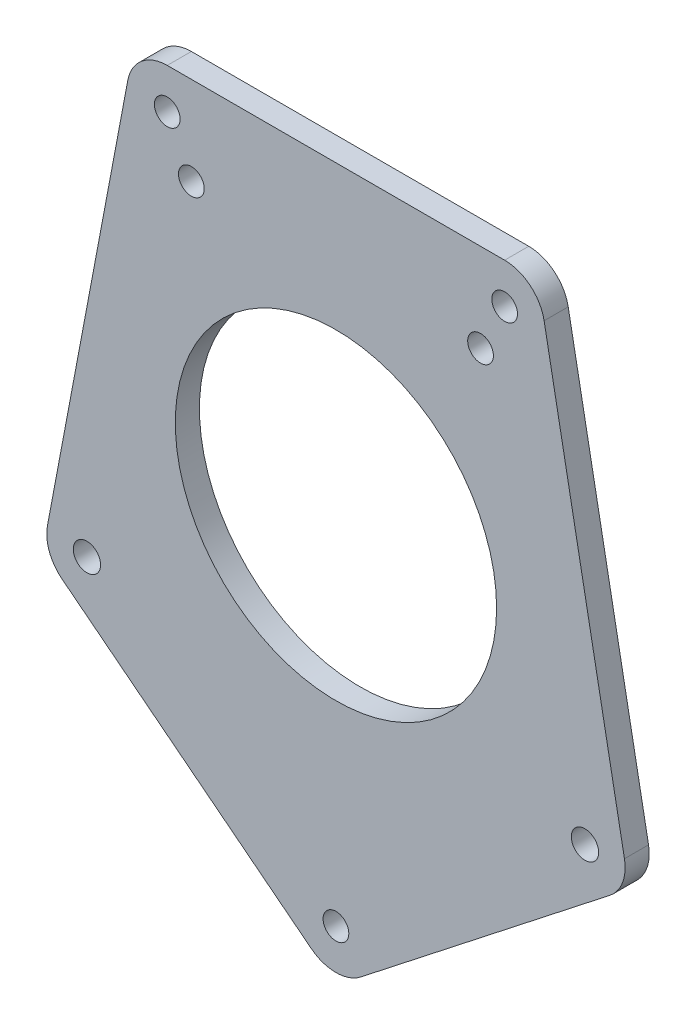
ISO-10303-21;
HEADER;
FILE_DESCRIPTION(('STEP AP214'),'2;1');
FILE_NAME('part.step','',(''),(''),'','','');
FILE_SCHEMA(('AUTOMOTIVE_DESIGN { 1 0 10303 214 1 1 1 1 }'));
ENDSEC;
DATA;
#1=APPLICATION_CONTEXT('core data for automotive mechanical design processes');
#2=APPLICATION_PROTOCOL_DEFINITION('international standard','automotive_design',2000,#1);
#3=PRODUCT_CONTEXT('',#1,'mechanical');
#4=PRODUCT('Part','Part','',(#3));
#5=PRODUCT_RELATED_PRODUCT_CATEGORY('part','',(#4));
#6=PRODUCT_DEFINITION_FORMATION('','',#4);
#7=PRODUCT_DEFINITION_CONTEXT('part definition',#1,'design');
#8=PRODUCT_DEFINITION('design','',#6,#7);
#9=PRODUCT_DEFINITION_SHAPE('','',#8);
#10=(LENGTH_UNIT() NAMED_UNIT(*) SI_UNIT(.MILLI.,.METRE.));
#11=(NAMED_UNIT(*) PLANE_ANGLE_UNIT() SI_UNIT($,.RADIAN.));
#12=(NAMED_UNIT(*) SI_UNIT($,.STERADIAN.) SOLID_ANGLE_UNIT());
#13=UNCERTAINTY_MEASURE_WITH_UNIT(LENGTH_MEASURE(1.E-05),#10,'distance_accuracy_value','');
#14=(GEOMETRIC_REPRESENTATION_CONTEXT(3) GLOBAL_UNCERTAINTY_ASSIGNED_CONTEXT((#13)) GLOBAL_UNIT_ASSIGNED_CONTEXT((#10,
#11,#12)) REPRESENTATION_CONTEXT('',''));
#15=CARTESIAN_POINT('',(0.,0.,0.));
#16=DIRECTION('',(0.,0.,1.));
#17=DIRECTION('',(1.,0.,0.));
#18=AXIS2_PLACEMENT_3D('',#15,#16,#17);
#19=CARTESIAN_POINT('',(-31.,0.,3.));
#20=DIRECTION('',(0.,0.,1.));
#21=DIRECTION('',(1.,0.,0.));
#22=AXIS2_PLACEMENT_3D('',#19,#20,#21);
#23=PLANE('',#22);
#24=CARTESIAN_POINT('',(18.,47.,3.));
#25=DIRECTION('',(0.,0.,1.));
#26=DIRECTION('',(1.,0.,0.));
#27=AXIS2_PLACEMENT_3D('',#24,#25,#26);
#28=CIRCLE('',#27,1.6);
#29=CARTESIAN_POINT('',(19.6,47.,3.));
#30=VERTEX_POINT('',#29);
#31=EDGE_CURVE('E242',#30,#30,#28,.T.);
#32=ORIENTED_EDGE('',*,*,#31,.F.);
#33=EDGE_LOOP('',(#32));
#34=FACE_BOUND('',#33,.T.);
#35=CARTESIAN_POINT('',(-18.,47.,3.));
#36=DIRECTION('',(0.,0.,1.));
#37=DIRECTION('',(1.,0.,0.));
#38=AXIS2_PLACEMENT_3D('',#35,#36,#37);
#39=CIRCLE('',#38,1.6);
#40=CARTESIAN_POINT('',(-16.4,47.,3.));
#41=VERTEX_POINT('',#40);
#42=EDGE_CURVE('E230',#41,#41,#39,.T.);
#43=ORIENTED_EDGE('',*,*,#42,.F.);
#44=EDGE_LOOP('',(#43));
#45=FACE_BOUND('',#44,.T.);
#46=CARTESIAN_POINT('',(31.,0.,3.));
#47=DIRECTION('',(0.,0.,1.));
#48=DIRECTION('',(1.,0.,0.));
#49=AXIS2_PLACEMENT_3D('',#46,#47,#48);
#50=CIRCLE('',#49,1.7);
#51=CARTESIAN_POINT('',(32.7,0.,3.));
#52=VERTEX_POINT('',#51);
#53=EDGE_CURVE('E218',#52,#52,#50,.T.);
#54=ORIENTED_EDGE('',*,*,#53,.F.);
#55=EDGE_LOOP('',(#54));
#56=FACE_BOUND('',#55,.T.);
#57=CARTESIAN_POINT('',(21.,53.,3.));
#58=DIRECTION('',(0.,0.,1.));
#59=DIRECTION('',(1.,0.,0.));
#60=AXIS2_PLACEMENT_3D('',#57,#58,#59);
#61=CIRCLE('',#60,1.6);
#62=CARTESIAN_POINT('',(22.6,53.,3.));
#63=VERTEX_POINT('',#62);
#64=EDGE_CURVE('E146',#63,#63,#61,.T.);
#65=ORIENTED_EDGE('',*,*,#64,.F.);
#66=EDGE_LOOP('',(#65));
#67=FACE_BOUND('',#66,.T.);
#68=CARTESIAN_POINT('',(-31.,0.,3.));
#69=DIRECTION('',(0.,0.,1.));
#70=DIRECTION('',(1.,0.,0.));
#71=AXIS2_PLACEMENT_3D('',#68,#69,#70);
#72=CIRCLE('',#71,5.);
#73=CARTESIAN_POINT('',(-35.9133082687424,0.927039295989146,3.));
#74=VERTEX_POINT('',#73);
#75=CARTESIAN_POINT('',(-34.0846208341593,-3.93511299831026,3.));
#76=VERTEX_POINT('',#75);
#77=EDGE_CURVE('E161',#74,#76,#72,.T.);
#78=ORIENTED_EDGE('',*,*,#77,.T.);
#79=DIRECTION('',(0.787022599662049,-0.616924166831864,0.));
#80=VECTOR('',#79,1.);
#81=CARTESIAN_POINT('',(-34.0846208341593,-3.93511299831026,3.));
#82=LINE('',#81,#80);
#83=CARTESIAN_POINT('',(-3.08462083415934,-28.2351129983102,3.));
#84=VERTEX_POINT('',#83);
#85=EDGE_CURVE('E99',#76,#84,#82,.T.);
#86=ORIENTED_EDGE('',*,*,#85,.T.);
#87=CARTESIAN_POINT('',(0.,-24.3,3.));
#88=DIRECTION('',(0.,0.,1.));
#89=DIRECTION('',(1.,0.,0.));
#90=AXIS2_PLACEMENT_3D('',#87,#88,#89);
#91=CIRCLE('',#90,5.);
#92=CARTESIAN_POINT('',(3.08462083415935,-28.2351129983102,3.));
#93=VERTEX_POINT('',#92);
#94=EDGE_CURVE('E182',#84,#93,#91,.T.);
#95=ORIENTED_EDGE('',*,*,#94,.T.);
#96=DIRECTION('',(0.787022599662049,0.616924166831864,0.));
#97=VECTOR('',#96,1.);
#98=CARTESIAN_POINT('',(3.08462083415935,-28.2351129983102,3.));
#99=LINE('',#98,#97);
#100=CARTESIAN_POINT('',(34.0846208341593,-3.93511299831026,3.));
#101=VERTEX_POINT('',#100);
#102=EDGE_CURVE('E201',#93,#101,#99,.T.);
#103=ORIENTED_EDGE('',*,*,#102,.T.);
#104=CARTESIAN_POINT('',(31.,0.,3.));
#105=DIRECTION('',(0.,0.,1.));
#106=DIRECTION('',(1.,0.,0.));
#107=AXIS2_PLACEMENT_3D('',#104,#105,#106);
#108=CIRCLE('',#107,5.);
#109=CARTESIAN_POINT('',(35.9133082687423,0.927039295989146,3.));
#110=VERTEX_POINT('',#109);
#111=EDGE_CURVE('E198',#101,#110,#108,.T.);
#112=ORIENTED_EDGE('',*,*,#111,.T.);
#113=DIRECTION('',(-0.185407859197825,0.982661653748471,0.));
#114=VECTOR('',#113,1.);
#115=CARTESIAN_POINT('',(35.9133082687423,0.927039295989146,3.));
#116=LINE('',#115,#114);
#117=CARTESIAN_POINT('',(25.9133082687424,53.9270392959891,3.));
#118=VERTEX_POINT('',#117);
#119=EDGE_CURVE('E200',#110,#118,#116,.T.);
#120=ORIENTED_EDGE('',*,*,#119,.T.);
#121=CARTESIAN_POINT('',(21.,53.,3.));
#122=DIRECTION('',(0.,0.,1.));
#123=DIRECTION('',(1.,0.,0.));
#124=AXIS2_PLACEMENT_3D('',#121,#122,#123);
#125=CIRCLE('',#124,5.);
#126=CARTESIAN_POINT('',(21.,58.,3.));
#127=VERTEX_POINT('',#126);
#128=EDGE_CURVE('E124',#118,#127,#125,.T.);
#129=ORIENTED_EDGE('',*,*,#128,.T.);
#130=DIRECTION('',(-1.,0.,0.));
#131=VECTOR('',#130,1.);
#132=CARTESIAN_POINT('',(21.,58.,3.));
#133=LINE('',#132,#131);
#134=CARTESIAN_POINT('',(-21.,58.,3.));
#135=VERTEX_POINT('',#134);
#136=EDGE_CURVE('E118',#127,#135,#133,.T.);
#137=ORIENTED_EDGE('',*,*,#136,.T.);
#138=CARTESIAN_POINT('',(-21.,53.,3.));
#139=DIRECTION('',(0.,0.,1.));
#140=DIRECTION('',(1.,0.,0.));
#141=AXIS2_PLACEMENT_3D('',#138,#139,#140);
#142=CIRCLE('',#141,5.);
#143=CARTESIAN_POINT('',(-25.9133082687424,53.9270392959891,3.));
#144=VERTEX_POINT('',#143);
#145=EDGE_CURVE('E122',#135,#144,#142,.T.);
#146=ORIENTED_EDGE('',*,*,#145,.T.);
#147=DIRECTION('',(-0.185407859197825,-0.982661653748471,0.));
#148=VECTOR('',#147,1.);
#149=CARTESIAN_POINT('',(-25.9133082687424,53.9270392959891,3.));
#150=LINE('',#149,#148);
#151=EDGE_CURVE('E50',#144,#74,#150,.T.);
#152=ORIENTED_EDGE('',*,*,#151,.T.);
#153=EDGE_LOOP('',(#78,#86,#95,#103,#112,#120,#129,#137,#146,#152));
#154=FACE_BOUND('',#153,.T.);
#155=CARTESIAN_POINT('',(-21.,53.,3.));
#156=DIRECTION('',(0.,0.,1.));
#157=DIRECTION('',(1.,0.,0.));
#158=AXIS2_PLACEMENT_3D('',#155,#156,#157);
#159=CIRCLE('',#158,1.6);
#160=CARTESIAN_POINT('',(-19.4,53.,3.));
#161=VERTEX_POINT('',#160);
#162=EDGE_CURVE('E212',#161,#161,#159,.T.);
#163=ORIENTED_EDGE('',*,*,#162,.F.);
#164=EDGE_LOOP('',(#163));
#165=FACE_BOUND('',#164,.T.);
#166=CARTESIAN_POINT('',(-31.,0.,3.));
#167=DIRECTION('',(0.,0.,1.));
#168=DIRECTION('',(1.,0.,0.));
#169=AXIS2_PLACEMENT_3D('',#166,#167,#168);
#170=CIRCLE('',#169,1.7);
#171=CARTESIAN_POINT('',(-29.3,0.,3.));
#172=VERTEX_POINT('',#171);
#173=EDGE_CURVE('E224',#172,#172,#170,.T.);
#174=ORIENTED_EDGE('',*,*,#173,.F.);
#175=EDGE_LOOP('',(#174));
#176=FACE_BOUND('',#175,.T.);
#177=CARTESIAN_POINT('',(0.,-24.3,3.));
#178=DIRECTION('',(0.,0.,1.));
#179=DIRECTION('',(1.,0.,0.));
#180=AXIS2_PLACEMENT_3D('',#177,#178,#179);
#181=CIRCLE('',#180,1.6);
#182=CARTESIAN_POINT('',(1.6,-24.3,3.));
#183=VERTEX_POINT('',#182);
#184=EDGE_CURVE('E236',#183,#183,#181,.T.);
#185=ORIENTED_EDGE('',*,*,#184,.F.);
#186=EDGE_LOOP('',(#185));
#187=FACE_BOUND('',#186,.T.);
#188=CARTESIAN_POINT('',(0.,20.,3.));
#189=DIRECTION('',(0.,0.,1.));
#190=DIRECTION('',(1.,0.,0.));
#191=AXIS2_PLACEMENT_3D('',#188,#189,#190);
#192=CIRCLE('',#191,20.);
#193=CARTESIAN_POINT('',(20.,20.,3.));
#194=VERTEX_POINT('',#193);
#195=EDGE_CURVE('E248',#194,#194,#192,.T.);
#196=ORIENTED_EDGE('',*,*,#195,.F.);
#197=EDGE_LOOP('',(#196));
#198=FACE_BOUND('',#197,.T.);
#199=ADVANCED_FACE('F33',(#34,#45,#56,#67,#154,#165,#176,#187,#198),#23,.T.);
#200=CARTESIAN_POINT('',(-31.,0.,0.));
#201=DIRECTION('',(0.,0.,1.));
#202=DIRECTION('',(1.,0.,0.));
#203=AXIS2_PLACEMENT_3D('',#200,#201,#202);
#204=PLANE('',#203);
#205=CARTESIAN_POINT('',(-31.,0.,0.));
#206=DIRECTION('',(0.,0.,1.));
#207=DIRECTION('',(1.,0.,0.));
#208=AXIS2_PLACEMENT_3D('',#205,#206,#207);
#209=CIRCLE('',#208,5.);
#210=CARTESIAN_POINT('',(-35.9133082687424,0.927039295989146,0.));
#211=VERTEX_POINT('',#210);
#212=CARTESIAN_POINT('',(-34.0846208341593,-3.93511299831026,0.));
#213=VERTEX_POINT('',#212);
#214=EDGE_CURVE('E142',#211,#213,#209,.T.);
#215=ORIENTED_EDGE('',*,*,#214,.F.);
#216=DIRECTION('',(-0.185407859197825,-0.982661653748471,0.));
#217=VECTOR('',#216,1.);
#218=CARTESIAN_POINT('',(-25.9133082687424,53.9270392959891,0.));
#219=LINE('',#218,#217);
#220=CARTESIAN_POINT('',(-25.9133082687424,53.9270392959891,0.));
#221=VERTEX_POINT('',#220);
#222=EDGE_CURVE('E91',#221,#211,#219,.T.);
#223=ORIENTED_EDGE('',*,*,#222,.F.);
#224=CARTESIAN_POINT('',(-21.,53.,0.));
#225=DIRECTION('',(0.,0.,1.));
#226=DIRECTION('',(1.,0.,0.));
#227=AXIS2_PLACEMENT_3D('',#224,#225,#226);
#228=CIRCLE('',#227,5.);
#229=CARTESIAN_POINT('',(-21.,58.,0.));
#230=VERTEX_POINT('',#229);
#231=EDGE_CURVE('E85',#230,#221,#228,.T.);
#232=ORIENTED_EDGE('',*,*,#231,.F.);
#233=DIRECTION('',(-1.,0.,0.));
#234=VECTOR('',#233,1.);
#235=CARTESIAN_POINT('',(21.,58.,0.));
#236=LINE('',#235,#234);
#237=CARTESIAN_POINT('',(21.,58.,0.));
#238=VERTEX_POINT('',#237);
#239=EDGE_CURVE('E132',#238,#230,#236,.T.);
#240=ORIENTED_EDGE('',*,*,#239,.F.);
#241=CARTESIAN_POINT('',(21.,53.,0.));
#242=DIRECTION('',(0.,0.,1.));
#243=DIRECTION('',(1.,0.,0.));
#244=AXIS2_PLACEMENT_3D('',#241,#242,#243);
#245=CIRCLE('',#244,5.);
#246=CARTESIAN_POINT('',(25.9133082687424,53.9270392959891,0.));
#247=VERTEX_POINT('',#246);
#248=EDGE_CURVE('E156',#247,#238,#245,.T.);
#249=ORIENTED_EDGE('',*,*,#248,.F.);
#250=DIRECTION('',(-0.185407859197825,0.982661653748471,0.));
#251=VECTOR('',#250,1.);
#252=CARTESIAN_POINT('',(35.9133082687423,0.927039295989146,0.));
#253=LINE('',#252,#251);
#254=CARTESIAN_POINT('',(35.9133082687423,0.927039295989146,0.));
#255=VERTEX_POINT('',#254);
#256=EDGE_CURVE('E154',#255,#247,#253,.T.);
#257=ORIENTED_EDGE('',*,*,#256,.F.);
#258=CARTESIAN_POINT('',(31.,0.,0.));
#259=DIRECTION('',(0.,0.,1.));
#260=DIRECTION('',(1.,0.,0.));
#261=AXIS2_PLACEMENT_3D('',#258,#259,#260);
#262=CIRCLE('',#261,5.);
#263=CARTESIAN_POINT('',(34.0846208341593,-3.93511299831026,0.));
#264=VERTEX_POINT('',#263);
#265=EDGE_CURVE('E152',#264,#255,#262,.T.);
#266=ORIENTED_EDGE('',*,*,#265,.F.);
#267=DIRECTION('',(0.787022599662049,0.616924166831864,0.));
#268=VECTOR('',#267,1.);
#269=CARTESIAN_POINT('',(3.08462083415935,-28.2351129983102,0.));
#270=LINE('',#269,#268);
#271=CARTESIAN_POINT('',(3.08462083415935,-28.2351129983102,0.));
#272=VERTEX_POINT('',#271);
#273=EDGE_CURVE('E150',#272,#264,#270,.T.);
#274=ORIENTED_EDGE('',*,*,#273,.F.);
#275=CARTESIAN_POINT('',(0.,-24.3,0.));
#276=DIRECTION('',(0.,0.,1.));
#277=DIRECTION('',(1.,0.,0.));
#278=AXIS2_PLACEMENT_3D('',#275,#276,#277);
#279=CIRCLE('',#278,5.);
#280=CARTESIAN_POINT('',(-3.08462083415934,-28.2351129983102,0.));
#281=VERTEX_POINT('',#280);
#282=EDGE_CURVE('E148',#281,#272,#279,.T.);
#283=ORIENTED_EDGE('',*,*,#282,.F.);
#284=DIRECTION('',(0.787022599662049,-0.616924166831864,0.));
#285=VECTOR('',#284,1.);
#286=CARTESIAN_POINT('',(-34.0846208341593,-3.93511299831026,0.));
#287=LINE('',#286,#285);
#288=EDGE_CURVE('E145',#213,#281,#287,.T.);
#289=ORIENTED_EDGE('',*,*,#288,.F.);
#290=EDGE_LOOP('',(#215,#223,#232,#240,#249,#257,#266,#274,#283,#289));
#291=FACE_BOUND('',#290,.T.);
#292=CARTESIAN_POINT('',(21.,53.,0.));
#293=DIRECTION('',(0.,0.,1.));
#294=DIRECTION('',(1.,0.,0.));
#295=AXIS2_PLACEMENT_3D('',#292,#293,#294);
#296=CIRCLE('',#295,1.6);
#297=CARTESIAN_POINT('',(22.6,53.,0.));
#298=VERTEX_POINT('',#297);
#299=EDGE_CURVE('E209',#298,#298,#296,.T.);
#300=ORIENTED_EDGE('',*,*,#299,.T.);
#301=EDGE_LOOP('',(#300));
#302=FACE_BOUND('',#301,.T.);
#303=CARTESIAN_POINT('',(-21.,53.,0.));
#304=DIRECTION('',(0.,0.,1.));
#305=DIRECTION('',(1.,0.,0.));
#306=AXIS2_PLACEMENT_3D('',#303,#304,#305);
#307=CIRCLE('',#306,1.6);
#308=CARTESIAN_POINT('',(-19.4,53.,0.));
#309=VERTEX_POINT('',#308);
#310=EDGE_CURVE('E215',#309,#309,#307,.T.);
#311=ORIENTED_EDGE('',*,*,#310,.T.);
#312=EDGE_LOOP('',(#311));
#313=FACE_BOUND('',#312,.T.);
#314=CARTESIAN_POINT('',(31.,0.,0.));
#315=DIRECTION('',(0.,0.,1.));
#316=DIRECTION('',(1.,0.,0.));
#317=AXIS2_PLACEMENT_3D('',#314,#315,#316);
#318=CIRCLE('',#317,1.7);
#319=CARTESIAN_POINT('',(32.7,0.,0.));
#320=VERTEX_POINT('',#319);
#321=EDGE_CURVE('E221',#320,#320,#318,.T.);
#322=ORIENTED_EDGE('',*,*,#321,.T.);
#323=EDGE_LOOP('',(#322));
#324=FACE_BOUND('',#323,.T.);
#325=CARTESIAN_POINT('',(-31.,0.,0.));
#326=DIRECTION('',(0.,0.,1.));
#327=DIRECTION('',(1.,0.,0.));
#328=AXIS2_PLACEMENT_3D('',#325,#326,#327);
#329=CIRCLE('',#328,1.7);
#330=CARTESIAN_POINT('',(-29.3,0.,0.));
#331=VERTEX_POINT('',#330);
#332=EDGE_CURVE('E227',#331,#331,#329,.T.);
#333=ORIENTED_EDGE('',*,*,#332,.T.);
#334=EDGE_LOOP('',(#333));
#335=FACE_BOUND('',#334,.T.);
#336=CARTESIAN_POINT('',(-18.,47.,0.));
#337=DIRECTION('',(0.,0.,1.));
#338=DIRECTION('',(1.,0.,0.));
#339=AXIS2_PLACEMENT_3D('',#336,#337,#338);
#340=CIRCLE('',#339,1.6);
#341=CARTESIAN_POINT('',(-16.4,47.,0.));
#342=VERTEX_POINT('',#341);
#343=EDGE_CURVE('E233',#342,#342,#340,.T.);
#344=ORIENTED_EDGE('',*,*,#343,.T.);
#345=EDGE_LOOP('',(#344));
#346=FACE_BOUND('',#345,.T.);
#347=CARTESIAN_POINT('',(0.,-24.3,0.));
#348=DIRECTION('',(0.,0.,1.));
#349=DIRECTION('',(1.,0.,0.));
#350=AXIS2_PLACEMENT_3D('',#347,#348,#349);
#351=CIRCLE('',#350,1.6);
#352=CARTESIAN_POINT('',(1.6,-24.3,0.));
#353=VERTEX_POINT('',#352);
#354=EDGE_CURVE('E239',#353,#353,#351,.T.);
#355=ORIENTED_EDGE('',*,*,#354,.T.);
#356=EDGE_LOOP('',(#355));
#357=FACE_BOUND('',#356,.T.);
#358=CARTESIAN_POINT('',(18.,47.,0.));
#359=DIRECTION('',(0.,0.,1.));
#360=DIRECTION('',(1.,0.,0.));
#361=AXIS2_PLACEMENT_3D('',#358,#359,#360);
#362=CIRCLE('',#361,1.6);
#363=CARTESIAN_POINT('',(19.6,47.,0.));
#364=VERTEX_POINT('',#363);
#365=EDGE_CURVE('E245',#364,#364,#362,.T.);
#366=ORIENTED_EDGE('',*,*,#365,.T.);
#367=EDGE_LOOP('',(#366));
#368=FACE_BOUND('',#367,.T.);
#369=CARTESIAN_POINT('',(0.,20.,0.));
#370=DIRECTION('',(0.,0.,1.));
#371=DIRECTION('',(1.,0.,0.));
#372=AXIS2_PLACEMENT_3D('',#369,#370,#371);
#373=CIRCLE('',#372,20.);
#374=CARTESIAN_POINT('',(20.,20.,0.));
#375=VERTEX_POINT('',#374);
#376=EDGE_CURVE('E251',#375,#375,#373,.T.);
#377=ORIENTED_EDGE('',*,*,#376,.T.);
#378=EDGE_LOOP('',(#377));
#379=FACE_BOUND('',#378,.T.);
#380=ADVANCED_FACE('F186',(#291,#302,#313,#324,#335,#346,#357,#368,#379),#204,.F.);
#381=CARTESIAN_POINT('',(-31.,0.,3.));
#382=DIRECTION('',(0.,0.,-1.));
#383=DIRECTION('',(-1.,0.,0.));
#384=AXIS2_PLACEMENT_3D('',#381,#382,#383);
#385=CYLINDRICAL_SURFACE('',#384,5.);
#386=ORIENTED_EDGE('',*,*,#214,.T.);
#387=DIRECTION('',(0.,0.,-1.));
#388=VECTOR('',#387,1.);
#389=CARTESIAN_POINT('',(-34.0846208341593,-3.93511299831026,3.));
#390=LINE('',#389,#388);
#391=EDGE_CURVE('E11',#76,#213,#390,.T.);
#392=ORIENTED_EDGE('',*,*,#391,.F.);
#393=ORIENTED_EDGE('',*,*,#77,.F.);
#394=DIRECTION('',(0.,0.,-1.));
#395=VECTOR('',#394,1.);
#396=CARTESIAN_POINT('',(-35.9133082687424,0.927039295989146,3.));
#397=LINE('',#396,#395);
#398=EDGE_CURVE('E138',#74,#211,#397,.T.);
#399=ORIENTED_EDGE('',*,*,#398,.T.);
#400=EDGE_LOOP('',(#386,#392,#393,#399));
#401=FACE_BOUND('',#400,.T.);
#402=ADVANCED_FACE('F35',(#401),#385,.T.);
#403=CARTESIAN_POINT('',(-34.0846208341593,-3.93511299831026,3.));
#404=DIRECTION('',(0.616924166831864,0.787022599662049,0.));
#405=DIRECTION('',(-0.787022599662049,0.616924166831864,0.));
#406=AXIS2_PLACEMENT_3D('',#403,#404,#405);
#407=PLANE('',#406);
#408=ORIENTED_EDGE('',*,*,#288,.T.);
#409=DIRECTION('',(0.,0.,-1.));
#410=VECTOR('',#409,1.);
#411=CARTESIAN_POINT('',(-3.08462083415934,-28.2351129983102,3.));
#412=LINE('',#411,#410);
#413=EDGE_CURVE('E42',#84,#281,#412,.T.);
#414=ORIENTED_EDGE('',*,*,#413,.F.);
#415=ORIENTED_EDGE('',*,*,#85,.F.);
#416=ORIENTED_EDGE('',*,*,#391,.T.);
#417=EDGE_LOOP('',(#408,#414,#415,#416));
#418=FACE_BOUND('',#417,.T.);
#419=ADVANCED_FACE('F293',(#418),#407,.F.);
#420=CARTESIAN_POINT('',(0.,-24.3,3.));
#421=DIRECTION('',(0.,0.,-1.));
#422=DIRECTION('',(-1.,0.,0.));
#423=AXIS2_PLACEMENT_3D('',#420,#421,#422);
#424=CYLINDRICAL_SURFACE('',#423,5.);
#425=ORIENTED_EDGE('',*,*,#282,.T.);
#426=DIRECTION('',(0.,0.,-1.));
#427=VECTOR('',#426,1.);
#428=CARTESIAN_POINT('',(3.08462083415935,-28.2351129983102,3.));
#429=LINE('',#428,#427);
#430=EDGE_CURVE('E174',#93,#272,#429,.T.);
#431=ORIENTED_EDGE('',*,*,#430,.F.);
#432=ORIENTED_EDGE('',*,*,#94,.F.);
#433=ORIENTED_EDGE('',*,*,#413,.T.);
#434=EDGE_LOOP('',(#425,#431,#432,#433));
#435=FACE_BOUND('',#434,.T.);
#436=ADVANCED_FACE('F180',(#435),#424,.T.);
#437=CARTESIAN_POINT('',(3.08462083415935,-28.2351129983102,3.));
#438=DIRECTION('',(-0.616924166831864,0.787022599662049,0.));
#439=DIRECTION('',(-0.787022599662049,-0.616924166831864,0.));
#440=AXIS2_PLACEMENT_3D('',#437,#438,#439);
#441=PLANE('',#440);
#442=ORIENTED_EDGE('',*,*,#273,.T.);
#443=DIRECTION('',(0.,0.,-1.));
#444=VECTOR('',#443,1.);
#445=CARTESIAN_POINT('',(34.0846208341593,-3.93511299831026,3.));
#446=LINE('',#445,#444);
#447=EDGE_CURVE('E171',#101,#264,#446,.T.);
#448=ORIENTED_EDGE('',*,*,#447,.F.);
#449=ORIENTED_EDGE('',*,*,#102,.F.);
#450=ORIENTED_EDGE('',*,*,#430,.T.);
#451=EDGE_LOOP('',(#442,#448,#449,#450));
#452=FACE_BOUND('',#451,.T.);
#453=ADVANCED_FACE('F192',(#452),#441,.F.);
#454=CARTESIAN_POINT('',(31.,0.,3.));
#455=DIRECTION('',(0.,0.,-1.));
#456=DIRECTION('',(-1.,0.,0.));
#457=AXIS2_PLACEMENT_3D('',#454,#455,#456);
#458=CYLINDRICAL_SURFACE('',#457,5.);
#459=ORIENTED_EDGE('',*,*,#265,.T.);
#460=DIRECTION('',(0.,0.,-1.));
#461=VECTOR('',#460,1.);
#462=CARTESIAN_POINT('',(35.9133082687423,0.927039295989146,3.));
#463=LINE('',#462,#461);
#464=EDGE_CURVE('E168',#110,#255,#463,.T.);
#465=ORIENTED_EDGE('',*,*,#464,.F.);
#466=ORIENTED_EDGE('',*,*,#111,.F.);
#467=ORIENTED_EDGE('',*,*,#447,.T.);
#468=EDGE_LOOP('',(#459,#465,#466,#467));
#469=FACE_BOUND('',#468,.T.);
#470=ADVANCED_FACE('F196',(#469),#458,.T.);
#471=CARTESIAN_POINT('',(35.9133082687423,0.927039295989146,3.));
#472=DIRECTION('',(-0.982661653748471,-0.185407859197825,0.));
#473=DIRECTION('',(0.185407859197825,-0.982661653748471,0.));
#474=AXIS2_PLACEMENT_3D('',#471,#472,#473);
#475=PLANE('',#474);
#476=ORIENTED_EDGE('',*,*,#256,.T.);
#477=DIRECTION('',(0.,0.,-1.));
#478=VECTOR('',#477,1.);
#479=CARTESIAN_POINT('',(25.9133082687424,53.9270392959891,3.));
#480=LINE('',#479,#478);
#481=EDGE_CURVE('E165',#118,#247,#480,.T.);
#482=ORIENTED_EDGE('',*,*,#481,.F.);
#483=ORIENTED_EDGE('',*,*,#119,.F.);
#484=ORIENTED_EDGE('',*,*,#464,.T.);
#485=EDGE_LOOP('',(#476,#482,#483,#484));
#486=FACE_BOUND('',#485,.T.);
#487=ADVANCED_FACE('F283',(#486),#475,.F.);
#488=CARTESIAN_POINT('',(21.,53.,3.));
#489=DIRECTION('',(0.,0.,-1.));
#490=DIRECTION('',(-1.,0.,0.));
#491=AXIS2_PLACEMENT_3D('',#488,#489,#490);
#492=CYLINDRICAL_SURFACE('',#491,5.);
#493=ORIENTED_EDGE('',*,*,#248,.T.);
#494=DIRECTION('',(0.,0.,-1.));
#495=VECTOR('',#494,1.);
#496=CARTESIAN_POINT('',(21.,58.,3.));
#497=LINE('',#496,#495);
#498=EDGE_CURVE('E133',#127,#238,#497,.T.);
#499=ORIENTED_EDGE('',*,*,#498,.F.);
#500=ORIENTED_EDGE('',*,*,#128,.F.);
#501=ORIENTED_EDGE('',*,*,#481,.T.);
#502=EDGE_LOOP('',(#493,#499,#500,#501));
#503=FACE_BOUND('',#502,.T.);
#504=ADVANCED_FACE('F280',(#503),#492,.T.);
#505=CARTESIAN_POINT('',(21.,58.,3.));
#506=DIRECTION('',(0.,-1.,0.));
#507=DIRECTION('',(0.,0.,-1.));
#508=AXIS2_PLACEMENT_3D('',#505,#506,#507);
#509=PLANE('',#508);
#510=ORIENTED_EDGE('',*,*,#239,.T.);
#511=DIRECTION('',(0.,0.,-1.));
#512=VECTOR('',#511,1.);
#513=CARTESIAN_POINT('',(-21.,58.,3.));
#514=LINE('',#513,#512);
#515=EDGE_CURVE('E129',#135,#230,#514,.T.);
#516=ORIENTED_EDGE('',*,*,#515,.F.);
#517=ORIENTED_EDGE('',*,*,#136,.F.);
#518=ORIENTED_EDGE('',*,*,#498,.T.);
#519=EDGE_LOOP('',(#510,#516,#517,#518));
#520=FACE_BOUND('',#519,.T.);
#521=ADVANCED_FACE('F130',(#520),#509,.F.);
#522=CARTESIAN_POINT('',(-21.,53.,3.));
#523=DIRECTION('',(0.,0.,-1.));
#524=DIRECTION('',(-1.,0.,0.));
#525=AXIS2_PLACEMENT_3D('',#522,#523,#524);
#526=CYLINDRICAL_SURFACE('',#525,5.);
#527=ORIENTED_EDGE('',*,*,#231,.T.);
#528=DIRECTION('',(0.,0.,-1.));
#529=VECTOR('',#528,1.);
#530=CARTESIAN_POINT('',(-25.9133082687424,53.9270392959891,3.));
#531=LINE('',#530,#529);
#532=EDGE_CURVE('E134',#144,#221,#531,.T.);
#533=ORIENTED_EDGE('',*,*,#532,.F.);
#534=ORIENTED_EDGE('',*,*,#145,.F.);
#535=ORIENTED_EDGE('',*,*,#515,.T.);
#536=EDGE_LOOP('',(#527,#533,#534,#535));
#537=FACE_BOUND('',#536,.T.);
#538=ADVANCED_FACE('F136',(#537),#526,.T.);
#539=CARTESIAN_POINT('',(-25.9133082687424,53.9270392959891,3.));
#540=DIRECTION('',(0.982661653748471,-0.185407859197825,0.));
#541=DIRECTION('',(0.185407859197825,0.982661653748471,0.));
#542=AXIS2_PLACEMENT_3D('',#539,#540,#541);
#543=PLANE('',#542);
#544=ORIENTED_EDGE('',*,*,#222,.T.);
#545=ORIENTED_EDGE('',*,*,#398,.F.);
#546=ORIENTED_EDGE('',*,*,#151,.F.);
#547=ORIENTED_EDGE('',*,*,#532,.T.);
#548=EDGE_LOOP('',(#544,#545,#546,#547));
#549=FACE_BOUND('',#548,.T.);
#550=ADVANCED_FACE('F273',(#549),#543,.F.);
#551=CARTESIAN_POINT('',(21.,53.,3.));
#552=DIRECTION('',(0.,0.,-1.));
#553=DIRECTION('',(-1.,0.,0.));
#554=AXIS2_PLACEMENT_3D('',#551,#552,#553);
#555=CYLINDRICAL_SURFACE('',#554,1.6);
#556=ORIENTED_EDGE('',*,*,#64,.T.);
#557=EDGE_LOOP('',(#556));
#558=FACE_BOUND('',#557,.T.);
#559=ORIENTED_EDGE('',*,*,#299,.F.);
#560=EDGE_LOOP('',(#559));
#561=FACE_BOUND('',#560,.T.);
#562=ADVANCED_FACE('F270',(#558,#561),#555,.F.);
#563=CARTESIAN_POINT('',(-21.,53.,3.));
#564=DIRECTION('',(0.,0.,-1.));
#565=DIRECTION('',(-1.,0.,0.));
#566=AXIS2_PLACEMENT_3D('',#563,#564,#565);
#567=CYLINDRICAL_SURFACE('',#566,1.6);
#568=ORIENTED_EDGE('',*,*,#162,.T.);
#569=EDGE_LOOP('',(#568));
#570=FACE_BOUND('',#569,.T.);
#571=ORIENTED_EDGE('',*,*,#310,.F.);
#572=EDGE_LOOP('',(#571));
#573=FACE_BOUND('',#572,.T.);
#574=ADVANCED_FACE('F369',(#570,#573),#567,.F.);
#575=CARTESIAN_POINT('',(31.,0.,3.));
#576=DIRECTION('',(0.,0.,-1.));
#577=DIRECTION('',(-1.,0.,0.));
#578=AXIS2_PLACEMENT_3D('',#575,#576,#577);
#579=CYLINDRICAL_SURFACE('',#578,1.7);
#580=ORIENTED_EDGE('',*,*,#53,.T.);
#581=EDGE_LOOP('',(#580));
#582=FACE_BOUND('',#581,.T.);
#583=ORIENTED_EDGE('',*,*,#321,.F.);
#584=EDGE_LOOP('',(#583));
#585=FACE_BOUND('',#584,.T.);
#586=ADVANCED_FACE('F377',(#582,#585),#579,.F.);
#587=CARTESIAN_POINT('',(-31.,0.,3.));
#588=DIRECTION('',(0.,0.,-1.));
#589=DIRECTION('',(-1.,0.,0.));
#590=AXIS2_PLACEMENT_3D('',#587,#588,#589);
#591=CYLINDRICAL_SURFACE('',#590,1.7);
#592=ORIENTED_EDGE('',*,*,#173,.T.);
#593=EDGE_LOOP('',(#592));
#594=FACE_BOUND('',#593,.T.);
#595=ORIENTED_EDGE('',*,*,#332,.F.);
#596=EDGE_LOOP('',(#595));
#597=FACE_BOUND('',#596,.T.);
#598=ADVANCED_FACE('F385',(#594,#597),#591,.F.);
#599=CARTESIAN_POINT('',(-18.,47.,3.));
#600=DIRECTION('',(0.,0.,-1.));
#601=DIRECTION('',(-1.,0.,0.));
#602=AXIS2_PLACEMENT_3D('',#599,#600,#601);
#603=CYLINDRICAL_SURFACE('',#602,1.6);
#604=ORIENTED_EDGE('',*,*,#42,.T.);
#605=EDGE_LOOP('',(#604));
#606=FACE_BOUND('',#605,.T.);
#607=ORIENTED_EDGE('',*,*,#343,.F.);
#608=EDGE_LOOP('',(#607));
#609=FACE_BOUND('',#608,.T.);
#610=ADVANCED_FACE('F394',(#606,#609),#603,.F.);
#611=CARTESIAN_POINT('',(0.,-24.3,3.));
#612=DIRECTION('',(0.,0.,-1.));
#613=DIRECTION('',(-1.,0.,0.));
#614=AXIS2_PLACEMENT_3D('',#611,#612,#613);
#615=CYLINDRICAL_SURFACE('',#614,1.6);
#616=ORIENTED_EDGE('',*,*,#184,.T.);
#617=EDGE_LOOP('',(#616));
#618=FACE_BOUND('',#617,.T.);
#619=ORIENTED_EDGE('',*,*,#354,.F.);
#620=EDGE_LOOP('',(#619));
#621=FACE_BOUND('',#620,.T.);
#622=ADVANCED_FACE('F403',(#618,#621),#615,.F.);
#623=CARTESIAN_POINT('',(18.,47.,3.));
#624=DIRECTION('',(0.,0.,-1.));
#625=DIRECTION('',(-1.,0.,0.));
#626=AXIS2_PLACEMENT_3D('',#623,#624,#625);
#627=CYLINDRICAL_SURFACE('',#626,1.6);
#628=ORIENTED_EDGE('',*,*,#31,.T.);
#629=EDGE_LOOP('',(#628));
#630=FACE_BOUND('',#629,.T.);
#631=ORIENTED_EDGE('',*,*,#365,.F.);
#632=EDGE_LOOP('',(#631));
#633=FACE_BOUND('',#632,.T.);
#634=ADVANCED_FACE('F412',(#630,#633),#627,.F.);
#635=CARTESIAN_POINT('',(0.,20.,3.));
#636=DIRECTION('',(0.,0.,-1.));
#637=DIRECTION('',(-1.,0.,0.));
#638=AXIS2_PLACEMENT_3D('',#635,#636,#637);
#639=CYLINDRICAL_SURFACE('',#638,20.);
#640=ORIENTED_EDGE('',*,*,#195,.T.);
#641=EDGE_LOOP('',(#640));
#642=FACE_BOUND('',#641,.T.);
#643=ORIENTED_EDGE('',*,*,#376,.F.);
#644=EDGE_LOOP('',(#643));
#645=FACE_BOUND('',#644,.T.);
#646=ADVANCED_FACE('F257',(#642,#645),#639,.F.);
#647=CLOSED_SHELL('',(#199,#380,#402,#419,#436,#453,#470,#487,#504,#521,#538,#550,#562,#574,
#586,#598,#610,#622,#634,#646));
#648=MANIFOLD_SOLID_BREP('B2',#647);
#649=ADVANCED_BREP_SHAPE_REPRESENTATION('',(#18,#648),#14);
#650=SHAPE_DEFINITION_REPRESENTATION(#9,#649);
ENDSEC;
END-ISO-10303-21;
